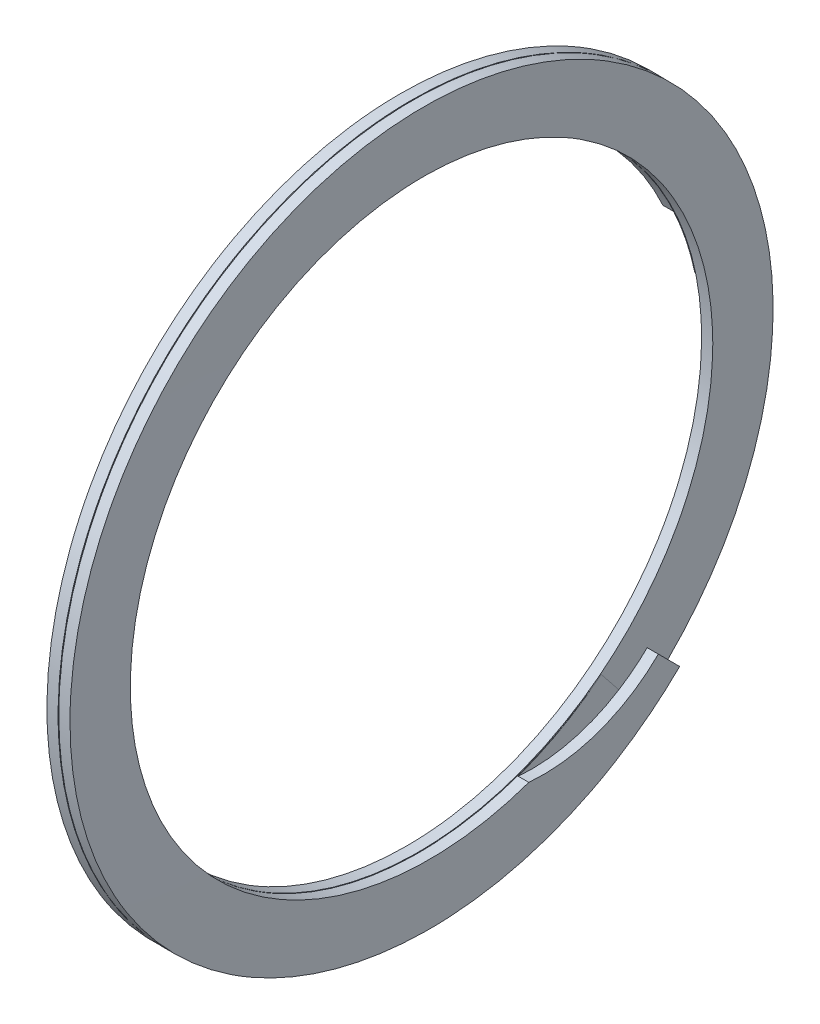
ISO-10303-21;
HEADER;
FILE_DESCRIPTION(('STEP AP214'),'2;1');
FILE_NAME('part.step','',(''),(''),'','','');
FILE_SCHEMA(('AUTOMOTIVE_DESIGN { 1 0 10303 214 1 1 1 1 }'));
ENDSEC;
DATA;
#1=APPLICATION_CONTEXT('core data for automotive mechanical design processes');
#2=APPLICATION_PROTOCOL_DEFINITION('international standard','automotive_design',2000,#1);
#3=PRODUCT_CONTEXT('',#1,'mechanical');
#4=PRODUCT('Part','Part','',(#3));
#5=PRODUCT_RELATED_PRODUCT_CATEGORY('part','',(#4));
#6=PRODUCT_DEFINITION_FORMATION('','',#4);
#7=PRODUCT_DEFINITION_CONTEXT('part definition',#1,'design');
#8=PRODUCT_DEFINITION('design','',#6,#7);
#9=PRODUCT_DEFINITION_SHAPE('','',#8);
#10=(LENGTH_UNIT() NAMED_UNIT(*) SI_UNIT(.MILLI.,.METRE.));
#11=(NAMED_UNIT(*) PLANE_ANGLE_UNIT() SI_UNIT($,.RADIAN.));
#12=(NAMED_UNIT(*) SI_UNIT($,.STERADIAN.) SOLID_ANGLE_UNIT());
#13=UNCERTAINTY_MEASURE_WITH_UNIT(LENGTH_MEASURE(1.E-05),#10,'distance_accuracy_value','');
#14=(GEOMETRIC_REPRESENTATION_CONTEXT(3) GLOBAL_UNCERTAINTY_ASSIGNED_CONTEXT((#13)) GLOBAL_UNIT_ASSIGNED_CONTEXT((#10,
#11,#12)) REPRESENTATION_CONTEXT('',''));
#15=CARTESIAN_POINT('',(0.,0.,0.));
#16=DIRECTION('',(0.,0.,1.));
#17=DIRECTION('',(1.,0.,0.));
#18=AXIS2_PLACEMENT_3D('',#15,#16,#17);
#19=CARTESIAN_POINT('',(0.211666666666667,0.,-5.5753));
#20=DIRECTION('',(0.,-1.,0.));
#21=DIRECTION('',(0.,0.,-1.));
#22=AXIS2_PLACEMENT_3D('',#19,#20,#21);
#23=PLANE('',#22);
#24=DIRECTION('',(0.,0.,-1.));
#25=VECTOR('',#24,1.);
#26=CARTESIAN_POINT('',(0.211666666666667,0.,-6.7183));
#27=LINE('',#26,#25);
#28=CARTESIAN_POINT('',(0.211666666666667,0.,-6.1468));
#29=VERTEX_POINT('',#28);
#30=CARTESIAN_POINT('',(0.211666666666667,0.,-6.7183));
#31=VERTEX_POINT('',#30);
#32=EDGE_CURVE('E268',#29,#31,#27,.T.);
#33=ORIENTED_EDGE('',*,*,#32,.F.);
#34=DIRECTION('',(-1.,0.,0.));
#35=VECTOR('',#34,1.);
#36=CARTESIAN_POINT('',(0.218722563923247,0.,-6.1468));
#37=LINE('',#36,#35);
#38=CARTESIAN_POINT('',(0.,0.,-6.1468));
#39=VERTEX_POINT('',#38);
#40=EDGE_CURVE('E186',#29,#39,#37,.T.);
#41=ORIENTED_EDGE('',*,*,#40,.T.);
#42=DIRECTION('',(0.,0.,1.));
#43=VECTOR('',#42,1.);
#44=CARTESIAN_POINT('',(0.,0.,-6.7183));
#45=LINE('',#44,#43);
#46=CARTESIAN_POINT('',(0.,0.,-6.7183));
#47=VERTEX_POINT('',#46);
#48=EDGE_CURVE('E265',#47,#39,#45,.T.);
#49=ORIENTED_EDGE('',*,*,#48,.F.);
#50=DIRECTION('',(-1.,0.,0.));
#51=VECTOR('',#50,1.);
#52=CARTESIAN_POINT('',(0.211666666666667,0.,-6.7183));
#53=LINE('',#52,#51);
#54=EDGE_CURVE('E282',#31,#47,#53,.T.);
#55=ORIENTED_EDGE('',*,*,#54,.F.);
#56=EDGE_LOOP('',(#33,#41,#49,#55));
#57=FACE_BOUND('',#56,.T.);
#58=ADVANCED_FACE('F32',(#57),#23,.T.);
#59=CARTESIAN_POINT('',(0.,0.,-6.7183));
#60=CARTESIAN_POINT('',(0.0188148148148148,3.87881231349666,-6.7183));
#61=CARTESIAN_POINT('',(0.0376296296296295,5.81821847024499,-3.35915));
#62=CARTESIAN_POINT('',(0.0564444444444443,7.75762462699332,0.));
#63=CARTESIAN_POINT('',(0.0752592592592591,5.81821847024499,3.35915));
#64=CARTESIAN_POINT('',(0.0940740740740739,3.87881231349667,6.7183));
#65=CARTESIAN_POINT('',(0.112888888888889,0.,6.7183));
#66=CARTESIAN_POINT('',(0.131703703703703,-3.87881231349666,6.7183));
#67=CARTESIAN_POINT('',(0.150518518518518,-5.81821847024499,3.35915));
#68=CARTESIAN_POINT('',(0.169333333333333,-7.75762462699332,0.));
#69=CARTESIAN_POINT('',(0.188148148148148,-5.818218470245,-3.35915));
#70=CARTESIAN_POINT('',(0.206962962962963,-3.87881231349667,-6.7183));
#71=CARTESIAN_POINT('',(0.225777777777777,0.,-6.7183));
#72=CARTESIAN_POINT('',(0.244592592592592,3.87881231349666,-6.7183));
#73=CARTESIAN_POINT('',(0.263407407407407,5.81821847024499,-3.35915));
#74=CARTESIAN_POINT('',(0.282222222222222,7.75762462699332,0.));
#75=CARTESIAN_POINT('',(0.301037037037036,5.81821847024499,3.35915));
#76=CARTESIAN_POINT('',(0.319851851851851,3.87881231349667,6.7183));
#77=CARTESIAN_POINT('',(0.338666666666666,0.,6.7183));
#78=CARTESIAN_POINT('',(0.357481481481481,-3.87881231349666,6.7183));
#79=CARTESIAN_POINT('',(0.376296296296295,-5.81821847024499,3.35915));
#80=CARTESIAN_POINT('',(0.39511111111111,-7.75762462699332,0.));
#81=CARTESIAN_POINT('',(0.413925925925925,-5.818218470245,-3.35915));
#82=CARTESIAN_POINT('',(0.43274074074074,-3.87881231349667,-6.7183));
#83=CARTESIAN_POINT('',(0.451555555555555,0.,-6.7183));
#84=CARTESIAN_POINT('',(0.,0.,-5.5753));
#85=CARTESIAN_POINT('',(0.0188148148148148,3.21890095581292,-5.5753));
#86=CARTESIAN_POINT('',(0.0376296296296295,4.82835143371938,-2.78765));
#87=CARTESIAN_POINT('',(0.0564444444444443,6.43780191162584,0.));
#88=CARTESIAN_POINT('',(0.0752592592592591,4.82835143371938,2.78765));
#89=CARTESIAN_POINT('',(0.0940740740740739,3.21890095581292,5.5753));
#90=CARTESIAN_POINT('',(0.112888888888889,0.,5.5753));
#91=CARTESIAN_POINT('',(0.131703703703703,-3.21890095581292,5.5753));
#92=CARTESIAN_POINT('',(0.150518518518518,-4.82835143371938,2.78765));
#93=CARTESIAN_POINT('',(0.169333333333333,-6.43780191162584,0.));
#94=CARTESIAN_POINT('',(0.188148148148148,-4.82835143371938,-2.78765));
#95=CARTESIAN_POINT('',(0.206962962962963,-3.21890095581292,-5.5753));
#96=CARTESIAN_POINT('',(0.225777777777777,0.,-5.5753));
#97=CARTESIAN_POINT('',(0.244592592592592,3.21890095581292,-5.5753));
#98=CARTESIAN_POINT('',(0.263407407407407,4.82835143371938,-2.78765));
#99=CARTESIAN_POINT('',(0.282222222222222,6.43780191162584,0.));
#100=CARTESIAN_POINT('',(0.301037037037036,4.82835143371938,2.78765));
#101=CARTESIAN_POINT('',(0.319851851851851,3.21890095581292,5.5753));
#102=CARTESIAN_POINT('',(0.338666666666666,0.,5.5753));
#103=CARTESIAN_POINT('',(0.357481481481481,-3.21890095581292,5.5753));
#104=CARTESIAN_POINT('',(0.376296296296295,-4.82835143371938,2.78765));
#105=CARTESIAN_POINT('',(0.39511111111111,-6.43780191162584,0.));
#106=CARTESIAN_POINT('',(0.413925925925925,-4.82835143371938,-2.78765));
#107=CARTESIAN_POINT('',(0.43274074074074,-3.21890095581292,-5.5753));
#108=CARTESIAN_POINT('',(0.451555555555555,0.,-5.5753));
#109=(BOUNDED_SURFACE() B_SPLINE_SURFACE(1,2,((#59,#60,#61,#62,#63,#64,#65,#66,#67,#68,#69,#70,
#71,#72,#73,#74,#75,#76,#77,#78,#79,#80,#81,#82,#83),(#84,#85,#86,#87,#88,#89,#90,#91,#92,#93,
#94,#95,#96,#97,#98,#99,#100,#101,#102,#103,#104,#105,#106,#107,#108)),.UNSPECIFIED.,.F.,.F.,
.F.) B_SPLINE_SURFACE_WITH_KNOTS((2,2),(3,2,2,2,2,2,2,2,2,2,2,2,3),(0.,1.),(0.,
0.0833333333333333,0.166666666666667,0.25,0.333333333333333,0.416666666666667,0.5,
0.583333333333333,0.666666666666667,0.75,0.833333333333333,0.916666666666667,1.),
.UNSPECIFIED.) GEOMETRIC_REPRESENTATION_ITEM() RATIONAL_B_SPLINE_SURFACE(((1.,0.866025403784439,
1.,0.866025403784439,1.,0.866025403784439,1.,0.866025403784439,1.,0.866025403784439,1.,
0.866025403784439,1.,0.866025403784439,1.,0.866025403784439,1.,0.866025403784439,1.,
0.866025403784439,1.,0.866025403784439,1.,0.866025403784439,1.),(1.,0.866025403784439,1.,
0.866025403784439,1.,0.866025403784439,1.,0.866025403784439,1.,0.866025403784439,1.,
0.866025403784439,1.,0.866025403784439,1.,0.866025403784439,1.,0.866025403784439,1.,
0.866025403784439,1.,0.866025403784439,1.,0.866025403784439,1.))) REPRESENTATION_ITEM('') SURFACE());
#110=CARTESIAN_POINT('',(0.423001478931439,-4.34644360397533,-4.34644432121943));
#111=CARTESIAN_POINT('',(0.422326869287209,-4.42733349051475,-4.26549969663493));
#112=CARTESIAN_POINT('',(0.421658307119178,-4.50329547718915,-4.18061420496704));
#113=CARTESIAN_POINT('',(0.420333277735516,-4.64536365080793,-4.00296148746445));
#114=CARTESIAN_POINT('',(0.419676810519884,-4.7114698377523,-3.91019426162976));
#115=CARTESIAN_POINT('',(0.419026390780453,-4.77264812483166,-3.81348616871167));
#116=B_SPLINE_CURVE_WITH_KNOTS('',3,(#110,#111,#112,#113,#114,#115),.UNSPECIFIED.,.F.,.F.,(4,2,
4),(0.,0.341739599425282,0.683479198850562),.UNSPECIFIED.);
#117=CARTESIAN_POINT('',(0.423167406132386,-4.34644360397537,-4.34644432121946));
#118=VERTEX_POINT('',#117);
#119=CARTESIAN_POINT('',(0.419026390780453,-4.77264812483164,-3.8134861687117));
#120=VERTEX_POINT('',#119);
#121=EDGE_CURVE('E112',#118,#120,#116,.T.);
#122=DIRECTION('',(0.,0.70710678118653,0.707106781186565));
#123=VECTOR('',#122,1.);
#124=CARTESIAN_POINT('',(0.423333333333333,-4.75055548804546,-4.7505554880457));
#125=LINE('',#124,#123);
#126=CARTESIAN_POINT('',(0.423166648143642,-4.75055511777032,-4.75055585832074));
#127=VERTEX_POINT('',#126);
#128=EDGE_CURVE('E35',#127,#118,#125,.T.);
#129=CARTESIAN_POINT('',(0.,0.,-6.7183));
#130=CARTESIAN_POINT('',(0.0188148148148148,3.87881231349666,-6.7183));
#131=CARTESIAN_POINT('',(0.0376296296296295,5.81821847024499,-3.35915));
#132=CARTESIAN_POINT('',(0.0564444444444443,7.75762462699332,0.));
#133=CARTESIAN_POINT('',(0.0752592592592591,5.81821847024499,3.35915));
#134=CARTESIAN_POINT('',(0.0940740740740739,3.87881231349667,6.7183));
#135=CARTESIAN_POINT('',(0.112888888888889,0.,6.7183));
#136=CARTESIAN_POINT('',(0.131703703703703,-3.87881231349666,6.7183));
#137=CARTESIAN_POINT('',(0.150518518518518,-5.81821847024499,3.35915));
#138=CARTESIAN_POINT('',(0.169333333333333,-7.75762462699332,0.));
#139=CARTESIAN_POINT('',(0.188148148148148,-5.818218470245,-3.35915));
#140=CARTESIAN_POINT('',(0.206962962962963,-3.87881231349667,-6.7183));
#141=CARTESIAN_POINT('',(0.225777777777777,0.,-6.7183));
#142=CARTESIAN_POINT('',(0.244592592592592,3.87881231349666,-6.7183));
#143=CARTESIAN_POINT('',(0.263407407407407,5.81821847024499,-3.35915));
#144=CARTESIAN_POINT('',(0.282222222222222,7.75762462699332,0.));
#145=CARTESIAN_POINT('',(0.301037037037036,5.818218470245,3.35914999999999));
#146=CARTESIAN_POINT('',(0.319851851851851,3.87881231349667,6.71829999999999));
#147=CARTESIAN_POINT('',(0.338666666666666,0.,6.7183));
#148=CARTESIAN_POINT('',(0.357481481481481,-3.87881231349666,6.7183));
#149=CARTESIAN_POINT('',(0.376296296296295,-5.81821847024499,3.35915000000001));
#150=CARTESIAN_POINT('',(0.39511111111111,-7.75762462699332,0.));
#151=CARTESIAN_POINT('',(0.413925925925925,-5.818218470245,-3.35914999999999));
#152=CARTESIAN_POINT('',(0.43274074074074,-3.87881231349667,-6.71829999999999));
#153=CARTESIAN_POINT('',(0.451555555555555,0.,-6.7183));
#154=(BOUNDED_CURVE() B_SPLINE_CURVE(2,(#129,#130,#131,#132,#133,#134,#135,#136,#137,#138,#139,
#140,#141,#142,#143,#144,#145,#146,#147,#148,#149,#150,#151,#152,#153),.UNSPECIFIED.,.F.,
.F.) B_SPLINE_CURVE_WITH_KNOTS((3,2,2,2,2,2,2,2,2,2,2,2,3),(0.,0.0833333333333333,
0.166666666666667,0.25,0.333333333333333,0.416666666666667,0.5,0.583333333333333,
0.666666666666667,0.75,0.833333333333333,0.916666666666667,1.),
.UNSPECIFIED.) CURVE() GEOMETRIC_REPRESENTATION_ITEM() RATIONAL_B_SPLINE_CURVE((1.,
0.866025403784439,1.,0.866025403784439,1.,0.866025403784439,1.,0.866025403784439,1.,
0.866025403784439,1.,0.866025403784439,1.,0.866025403784439,1.,0.866025403784439,1.,
0.866025403784439,1.,0.866025403784439,1.,0.866025403784439,1.,0.866025403784439,1.)) REPRESENTATION_ITEM(''));
#155=EDGE_CURVE('E253',#47,#127,#154,.T.);
#156=CARTESIAN_POINT('',(0.,0.,-6.1468));
#157=CARTESIAN_POINT('',(0.000459855154340558,0.0867390332436209,-6.14680840386976));
#158=CARTESIAN_POINT('',(0.000925320167877159,0.173474234481937,-6.14314145356558));
#159=CARTESIAN_POINT('',(0.00186664739999395,0.346326178983546,-6.12852126715385));
#160=CARTESIAN_POINT('',(0.00234250934474222,0.432442938456029,-6.11756822272252));
#161=CARTESIAN_POINT('',(0.00330370722968058,0.603429601239146,-6.08844405102077));
#162=CARTESIAN_POINT('',(0.0037890406743925,0.688299822919678,-6.07027480124511));
#163=CARTESIAN_POINT('',(0.00476826083430785,0.856185944339623,-6.02686471345591));
#164=CARTESIAN_POINT('',(0.00526214724722489,0.939201909377285,-6.00162412488711));
#165=CARTESIAN_POINT('',(0.00675612056951717,1.18470316238575,-5.9154929243309));
#166=CARTESIAN_POINT('',(0.00776866174448775,1.34366700645911,-5.84418856110767));
#167=CARTESIAN_POINT('',(0.00981663711078338,1.64714462695747,-5.67596650034187));
#168=CARTESIAN_POINT('',(0.0108520433944109,1.79167494560299,-5.57907859931022));
#169=CARTESIAN_POINT('',(0.0124976222770556,2.00512729277105,-5.40832581014503));
#170=CARTESIAN_POINT('',(0.0131027199846867,2.08020360591022,-5.34201696728692));
#171=CARTESIAN_POINT('',(0.0143164008409924,2.22348825923495,-5.20250601238596));
#172=CARTESIAN_POINT('',(0.0149249793400266,2.29170417925359,-5.12931168493756));
#173=CARTESIAN_POINT('',(0.0155351764951114,2.35622359468146,-5.05293780506714));
#174=B_SPLINE_CURVE_WITH_KNOTS('',3,(#156,#157,#158,#159,#160,#161,#162,#163,#164,#165,#166,
#167,#168,#169,#170,#171,#172,#173),.UNSPECIFIED.,.F.,.F.,(4,2,2,2,2,2,2,2,4),(0.,
0.260136445567346,0.520266047962052,0.780328014758219,1.04038080890276,1.56041067518249,
2.07983752678275,2.37991096728854,2.67964913712295),.UNSPECIFIED.);
#175=CARTESIAN_POINT('',(0.015535176495125,2.35622359468289,-5.05293780506545));
#176=VERTEX_POINT('',#175);
#177=EDGE_CURVE('E184',#39,#176,#174,.T.);
#178=CARTESIAN_POINT('',(0.,0.,-5.5753));
#179=CARTESIAN_POINT('',(0.0188148148148148,3.21890095581292,-5.5753));
#180=CARTESIAN_POINT('',(0.0376296296296295,4.82835143371938,-2.78765));
#181=CARTESIAN_POINT('',(0.0564444444444443,6.43780191162584,0.));
#182=CARTESIAN_POINT('',(0.0752592592592591,4.82835143371938,2.78765));
#183=CARTESIAN_POINT('',(0.0940740740740739,3.21890095581292,5.5753));
#184=CARTESIAN_POINT('',(0.112888888888889,0.,5.5753));
#185=CARTESIAN_POINT('',(0.131703703703703,-3.21890095581292,5.5753));
#186=CARTESIAN_POINT('',(0.150518518518518,-4.82835143371938,2.78765));
#187=CARTESIAN_POINT('',(0.169333333333333,-6.43780191162584,0.));
#188=CARTESIAN_POINT('',(0.188148148148148,-4.82835143371938,-2.78765));
#189=CARTESIAN_POINT('',(0.206962962962963,-3.21890095581292,-5.5753));
#190=CARTESIAN_POINT('',(0.225777777777777,0.,-5.5753));
#191=CARTESIAN_POINT('',(0.244592592592592,3.21890095581292,-5.5753));
#192=CARTESIAN_POINT('',(0.263407407407407,4.82835143371938,-2.78765));
#193=CARTESIAN_POINT('',(0.282222222222222,6.43780191162584,0.));
#194=CARTESIAN_POINT('',(0.301037037037036,4.82835143371938,2.78765));
#195=CARTESIAN_POINT('',(0.319851851851851,3.21890095581293,5.5753));
#196=CARTESIAN_POINT('',(0.338666666666666,0.,5.5753));
#197=CARTESIAN_POINT('',(0.357481481481481,-3.21890095581291,5.5753));
#198=CARTESIAN_POINT('',(0.376296296296295,-4.82835143371938,2.78765000000001));
#199=CARTESIAN_POINT('',(0.39511111111111,-6.43780191162584,0.));
#200=CARTESIAN_POINT('',(0.413925925925925,-4.82835143371938,-2.78765));
#201=CARTESIAN_POINT('',(0.43274074074074,-3.21890095581293,-5.5753));
#202=CARTESIAN_POINT('',(0.451555555555555,0.,-5.5753));
#203=(BOUNDED_CURVE() B_SPLINE_CURVE(2,(#178,#179,#180,#181,#182,#183,#184,#185,#186,#187,#188,
#189,#190,#191,#192,#193,#194,#195,#196,#197,#198,#199,#200,#201,#202),.UNSPECIFIED.,.F.,
.F.) B_SPLINE_CURVE_WITH_KNOTS((3,2,2,2,2,2,2,2,2,2,2,2,3),(0.,0.0833333333333333,
0.166666666666667,0.25,0.333333333333333,0.416666666666667,0.5,0.583333333333333,
0.666666666666667,0.75,0.833333333333333,0.916666666666667,1.),
.UNSPECIFIED.) CURVE() GEOMETRIC_REPRESENTATION_ITEM() RATIONAL_B_SPLINE_CURVE((1.,
0.866025403784439,1.,0.866025403784439,1.,0.866025403784439,1.,0.866025403784439,1.,
0.866025403784439,1.,0.866025403784439,1.,0.866025403784439,1.,0.866025403784439,1.,
0.866025403784439,1.,0.866025403784439,1.,0.866025403784439,1.,0.866025403784439,1.)) REPRESENTATION_ITEM(''));
#204=CARTESIAN_POINT('',(0.419026390780453,-4.35563934550005,-3.48028389387009));
#205=VERTEX_POINT('',#204);
#206=EDGE_CURVE('E260',#176,#205,#203,.T.);
#207=CARTESIAN_POINT('',(0.419026390780453,-5.24859501997615,-4.19378173088223));
#208=CARTESIAN_POINT('',(0.419026390780453,-5.16267032013729,-4.1251253695047));
#209=CARTESIAN_POINT('',(0.419026390780453,-5.07674562029843,-4.05646900812717));
#210=CARTESIAN_POINT('',(0.419026390780453,-4.90489622062071,-3.91915628537212));
#211=CARTESIAN_POINT('',(0.419026390780453,-4.81897152078185,-3.85049992399459));
#212=CARTESIAN_POINT('',(0.419026390780453,-4.60724432912868,-3.68132367303474));
#213=CARTESIAN_POINT('',(0.419026390780453,-4.48144183731438,-3.58080378345243));
#214=CARTESIAN_POINT('',(0.419026390780453,-4.35563934550007,-3.48028389387011));
#215=B_SPLINE_CURVE_WITH_KNOTS('',3,(#207,#208,#209,#210,#211,#212,#213,#214),.UNSPECIFIED.,.F.,
.F.,(4,2,2,4),(0.,0.329955678841871,0.659911357683742,1.143),.UNSPECIFIED.);
#216=EDGE_CURVE('E103',#120,#205,#215,.T.);
#217=ORIENTED_EDGE('',*,*,#121,.F.);
#218=ORIENTED_EDGE('',*,*,#128,.F.);
#219=ORIENTED_EDGE('',*,*,#155,.F.);
#220=ORIENTED_EDGE('',*,*,#48,.T.);
#221=ORIENTED_EDGE('',*,*,#177,.T.);
#222=ORIENTED_EDGE('',*,*,#206,.T.);
#223=ORIENTED_EDGE('',*,*,#216,.F.);
#224=EDGE_LOOP('',(#217,#218,#219,#220,#221,#222,#223));
#225=FACE_BOUND('',#224,.T.);
#226=ADVANCED_FACE('F155',(#225),#109,.T.);
#227=CARTESIAN_POINT('',(0.,0.,0.));
#228=DIRECTION('',(1.,0.,0.));
#229=DIRECTION('',(0.,0.,-1.));
#230=AXIS2_PLACEMENT_3D('',#227,#228,#229);
#231=CYLINDRICAL_SURFACE('',#230,5.5753);
#232=DIRECTION('',(1.,0.,0.));
#233=VECTOR('',#232,1.);
#234=CARTESIAN_POINT('',(0.419026390780453,-5.23906810084237,-1.90686536617969));
#235=LINE('',#234,#233);
#236=CARTESIAN_POINT('',(0.419026390780453,-5.23906810084237,-1.90686536617969));
#237=VERTEX_POINT('',#236);
#238=CARTESIAN_POINT('',(0.619647872209092,-5.23906810084237,-1.90686536617969));
#239=VERTEX_POINT('',#238);
#240=EDGE_CURVE('E108',#237,#239,#235,.T.);
#241=ORIENTED_EDGE('',*,*,#240,.F.);
#242=CARTESIAN_POINT('',(0.419026390780453,0.,0.));
#243=DIRECTION('',(-1.,0.,0.));
#244=DIRECTION('',(0.,0.,1.));
#245=AXIS2_PLACEMENT_3D('',#242,#243,#244);
#246=CIRCLE('',#245,5.57529999999997);
#247=EDGE_CURVE('E98',#205,#237,#246,.T.);
#248=ORIENTED_EDGE('',*,*,#247,.F.);
#249=ORIENTED_EDGE('',*,*,#206,.F.);
#250=DIRECTION('',(-1.,0.,0.));
#251=VECTOR('',#250,1.);
#252=CARTESIAN_POINT('',(0.218722563923247,2.35622359468289,-5.05293780506545));
#253=LINE('',#252,#251);
#254=CARTESIAN_POINT('',(0.218722563923247,2.35622359468289,-5.05293780506545));
#255=VERTEX_POINT('',#254);
#256=EDGE_CURVE('E189',#255,#176,#253,.T.);
#257=ORIENTED_EDGE('',*,*,#256,.F.);
#258=CARTESIAN_POINT('',(0.218722563923247,0.,0.));
#259=DIRECTION('',(-1.,0.,0.));
#260=DIRECTION('',(0.,0.,-1.));
#261=AXIS2_PLACEMENT_3D('',#258,#259,#260);
#262=CIRCLE('',#261,5.5753);
#263=CARTESIAN_POINT('',(0.218722563923247,1.13923059145724,-5.45766651138451));
#264=VERTEX_POINT('',#263);
#265=EDGE_CURVE('E190',#255,#264,#262,.T.);
#266=ORIENTED_EDGE('',*,*,#265,.T.);
#267=CARTESIAN_POINT('',(0.211666666666667,0.,-5.5753));
#268=CARTESIAN_POINT('',(0.230481481481482,3.21890095581292,-5.5753));
#269=CARTESIAN_POINT('',(0.249296296296296,4.82835143371938,-2.78765));
#270=CARTESIAN_POINT('',(0.268111111111111,6.43780191162584,0.));
#271=CARTESIAN_POINT('',(0.286925925925926,4.82835143371938,2.78765));
#272=CARTESIAN_POINT('',(0.305740740740741,3.21890095581292,5.5753));
#273=CARTESIAN_POINT('',(0.324555555555555,0.,5.5753));
#274=CARTESIAN_POINT('',(0.34337037037037,-3.21890095581292,5.5753));
#275=CARTESIAN_POINT('',(0.362185185185185,-4.82835143371938,2.78765));
#276=CARTESIAN_POINT('',(0.381,-6.43780191162584,0.));
#277=CARTESIAN_POINT('',(0.399814814814815,-4.82835143371938,-2.78765));
#278=CARTESIAN_POINT('',(0.418629629629629,-3.21890095581292,-5.5753));
#279=CARTESIAN_POINT('',(0.437444444444444,0.,-5.5753));
#280=CARTESIAN_POINT('',(0.456259259259259,3.21890095581292,-5.5753));
#281=CARTESIAN_POINT('',(0.475074074074074,4.82835143371938,-2.78765));
#282=CARTESIAN_POINT('',(0.493888888888888,6.43780191162584,0.));
#283=CARTESIAN_POINT('',(0.512703703703703,4.82835143371938,2.78765));
#284=CARTESIAN_POINT('',(0.531518518518518,3.21890095581293,5.5753));
#285=CARTESIAN_POINT('',(0.550333333333333,0.,5.5753));
#286=CARTESIAN_POINT('',(0.569148148148148,-3.21890095581291,5.5753));
#287=CARTESIAN_POINT('',(0.587962962962962,-4.82835143371938,2.78765000000001));
#288=CARTESIAN_POINT('',(0.606777777777777,-6.43780191162584,0.));
#289=CARTESIAN_POINT('',(0.625592592592592,-4.82835143371938,-2.78765));
#290=CARTESIAN_POINT('',(0.644407407407407,-3.21890095581293,-5.5753));
#291=CARTESIAN_POINT('',(0.663222222222221,0.,-5.5753));
#292=(BOUNDED_CURVE() B_SPLINE_CURVE(2,(#267,#268,#269,#270,#271,#272,#273,#274,#275,#276,#277,
#278,#279,#280,#281,#282,#283,#284,#285,#286,#287,#288,#289,#290,#291),.UNSPECIFIED.,.F.,
.F.) B_SPLINE_CURVE_WITH_KNOTS((3,2,2,2,2,2,2,2,2,2,2,2,3),(0.,0.0833333333333333,
0.166666666666667,0.25,0.333333333333333,0.416666666666667,0.5,0.583333333333333,
0.666666666666667,0.75,0.833333333333333,0.916666666666667,1.),
.UNSPECIFIED.) CURVE() GEOMETRIC_REPRESENTATION_ITEM() RATIONAL_B_SPLINE_CURVE((1.,
0.866025403784439,1.,0.866025403784439,1.,0.866025403784439,1.,0.866025403784439,1.,
0.866025403784439,1.,0.866025403784439,1.,0.866025403784439,1.,0.866025403784439,1.,
0.866025403784439,1.,0.866025403784439,1.,0.866025403784439,1.,0.866025403784439,1.)) REPRESENTATION_ITEM(''));
#293=EDGE_CURVE('E118',#264,#239,#292,.T.);
#294=ORIENTED_EDGE('',*,*,#293,.T.);
#295=EDGE_LOOP('',(#241,#248,#249,#257,#266,#294));
#296=FACE_BOUND('',#295,.T.);
#297=ADVANCED_FACE('F115',(#296),#231,.F.);
#298=CARTESIAN_POINT('',(0.211666666666667,0.,-5.5753));
#299=CARTESIAN_POINT('',(0.230481481481482,3.21890095581292,-5.5753));
#300=CARTESIAN_POINT('',(0.249296296296296,4.82835143371938,-2.78765));
#301=CARTESIAN_POINT('',(0.268111111111111,6.43780191162584,0.));
#302=CARTESIAN_POINT('',(0.286925925925926,4.82835143371938,2.78765));
#303=CARTESIAN_POINT('',(0.305740740740741,3.21890095581292,5.5753));
#304=CARTESIAN_POINT('',(0.324555555555555,0.,5.5753));
#305=CARTESIAN_POINT('',(0.34337037037037,-3.21890095581292,5.5753));
#306=CARTESIAN_POINT('',(0.362185185185185,-4.82835143371938,2.78765));
#307=CARTESIAN_POINT('',(0.381,-6.43780191162584,0.));
#308=CARTESIAN_POINT('',(0.399814814814815,-4.82835143371938,-2.78765));
#309=CARTESIAN_POINT('',(0.418629629629629,-3.21890095581292,-5.5753));
#310=CARTESIAN_POINT('',(0.437444444444444,0.,-5.5753));
#311=CARTESIAN_POINT('',(0.456259259259259,3.21890095581292,-5.5753));
#312=CARTESIAN_POINT('',(0.475074074074074,4.82835143371938,-2.78765));
#313=CARTESIAN_POINT('',(0.493888888888888,6.43780191162584,0.));
#314=CARTESIAN_POINT('',(0.512703703703703,4.82835143371938,2.78765));
#315=CARTESIAN_POINT('',(0.531518518518518,3.21890095581292,5.5753));
#316=CARTESIAN_POINT('',(0.550333333333333,0.,5.5753));
#317=CARTESIAN_POINT('',(0.569148148148148,-3.21890095581292,5.5753));
#318=CARTESIAN_POINT('',(0.587962962962962,-4.82835143371938,2.78765));
#319=CARTESIAN_POINT('',(0.606777777777777,-6.43780191162584,0.));
#320=CARTESIAN_POINT('',(0.625592592592592,-4.82835143371938,-2.78765));
#321=CARTESIAN_POINT('',(0.644407407407407,-3.21890095581292,-5.5753));
#322=CARTESIAN_POINT('',(0.663222222222221,0.,-5.5753));
#323=CARTESIAN_POINT('',(0.211666666666667,0.,-6.7183));
#324=CARTESIAN_POINT('',(0.230481481481481,3.87881231349666,-6.7183));
#325=CARTESIAN_POINT('',(0.249296296296296,5.81821847024499,-3.35915));
#326=CARTESIAN_POINT('',(0.268111111111111,7.75762462699332,0.));
#327=CARTESIAN_POINT('',(0.286925925925926,5.81821847024499,3.35915));
#328=CARTESIAN_POINT('',(0.305740740740741,3.87881231349667,6.7183));
#329=CARTESIAN_POINT('',(0.324555555555555,0.,6.7183));
#330=CARTESIAN_POINT('',(0.34337037037037,-3.87881231349666,6.7183));
#331=CARTESIAN_POINT('',(0.362185185185185,-5.81821847024499,3.35915));
#332=CARTESIAN_POINT('',(0.381,-7.75762462699332,0.));
#333=CARTESIAN_POINT('',(0.399814814814814,-5.818218470245,-3.35915));
#334=CARTESIAN_POINT('',(0.418629629629629,-3.87881231349667,-6.7183));
#335=CARTESIAN_POINT('',(0.437444444444444,0.,-6.7183));
#336=CARTESIAN_POINT('',(0.456259259259259,3.87881231349666,-6.7183));
#337=CARTESIAN_POINT('',(0.475074074074073,5.81821847024499,-3.35915));
#338=CARTESIAN_POINT('',(0.493888888888888,7.75762462699332,0.));
#339=CARTESIAN_POINT('',(0.512703703703703,5.81821847024499,3.35915));
#340=CARTESIAN_POINT('',(0.531518518518518,3.87881231349667,6.7183));
#341=CARTESIAN_POINT('',(0.550333333333333,0.,6.7183));
#342=CARTESIAN_POINT('',(0.569148148148147,-3.87881231349666,6.7183));
#343=CARTESIAN_POINT('',(0.587962962962962,-5.81821847024499,3.35915));
#344=CARTESIAN_POINT('',(0.606777777777777,-7.75762462699332,0.));
#345=CARTESIAN_POINT('',(0.625592592592592,-5.818218470245,-3.35915));
#346=CARTESIAN_POINT('',(0.644407407407406,-3.87881231349667,-6.7183));
#347=CARTESIAN_POINT('',(0.663222222222221,0.,-6.7183));
#348=(BOUNDED_SURFACE() B_SPLINE_SURFACE(1,2,((#298,#299,#300,#301,#302,#303,#304,#305,#306,
#307,#308,#309,#310,#311,#312,#313,#314,#315,#316,#317,#318,#319,#320,#321,#322),(#323,#324,
#325,#326,#327,#328,#329,#330,#331,#332,#333,#334,#335,#336,#337,#338,#339,#340,#341,#342,#343,
#344,#345,#346,#347)),.UNSPECIFIED.,.F.,.F.,.F.) B_SPLINE_SURFACE_WITH_KNOTS((2,2),(3,2,2,2,2,2,
2,2,2,2,2,2,3),(0.,1.),(0.,0.0833333333333333,0.166666666666667,0.25,0.333333333333333,
0.416666666666667,0.5,0.583333333333333,0.666666666666667,0.75,0.833333333333333,
0.916666666666667,1.),
.UNSPECIFIED.) GEOMETRIC_REPRESENTATION_ITEM() RATIONAL_B_SPLINE_SURFACE(((1.,0.866025403784439,
1.,0.866025403784439,1.,0.866025403784439,1.,0.866025403784439,1.,0.866025403784439,1.,
0.866025403784439,1.,0.866025403784439,1.,0.866025403784439,1.,0.866025403784439,1.,
0.866025403784439,1.,0.866025403784439,1.,0.866025403784439,1.),(1.,0.866025403784439,1.,
0.866025403784439,1.,0.866025403784439,1.,0.866025403784439,1.,0.866025403784439,1.,
0.866025403784439,1.,0.866025403784439,1.,0.866025403784439,1.,0.866025403784439,1.,
0.866025403784439,1.,0.866025403784439,1.,0.866025403784439,1.))) REPRESENTATION_ITEM('') SURFACE());
#349=CARTESIAN_POINT('',(0.619647872209092,-5.2390681008424,-1.9068653661797));
#350=CARTESIAN_POINT('',(0.620147505941713,-5.24634302769611,-1.99329874832244));
#351=CARTESIAN_POINT('',(0.620642828083451,-5.24995520593463,-2.0800362701584));
#352=CARTESIAN_POINT('',(0.621624801337743,-5.24986706630478,-2.25350554617497));
#353=CARTESIAN_POINT('',(0.622111452677733,-5.24616694052479,-2.34023730044723));
#354=CARTESIAN_POINT('',(0.623075937349772,-5.23146948551195,-2.51306313194133));
#355=CARTESIAN_POINT('',(0.623553772941345,-5.22047405357972,-2.59915736907809));
#356=CARTESIAN_POINT('',(0.624495768416191,-5.19128104507959,-2.77009056993409));
#357=CARTESIAN_POINT('',(0.624959928781442,-5.17308372266659,-2.85492957784083));
#358=CARTESIAN_POINT('',(0.626354078832349,-5.10782175540355,-3.10678421133712));
#359=CARTESIAN_POINT('',(0.627285873715622,-5.05008489402659,-3.27116322345343));
#360=CARTESIAN_POINT('',(0.629198058873819,-4.90787724518026,-3.58766749677951));
#361=CARTESIAN_POINT('',(0.630178391540956,-4.82343753792016,-3.73980674724757));
#362=CARTESIAN_POINT('',(0.631745967358284,-4.67116683248205,-3.96681294043759));
#363=CARTESIAN_POINT('',(0.632324380286167,-4.61138098342596,-4.04717963514042));
#364=CARTESIAN_POINT('',(0.633489685239753,-4.48436502338517,-4.20164675966995));
#365=CARTESIAN_POINT('',(0.634076567070678,-4.41714330374462,-4.27575408985428));
#366=CARTESIAN_POINT('',(0.634668145598105,-4.34644360397538,-4.34644432121945));
#367=B_SPLINE_CURVE_WITH_KNOTS('',3,(#349,#350,#351,#352,#353,#354,#355,#356,#357,#358,#359,
#360,#361,#362,#363,#364,#365,#366),.UNSPECIFIED.,.F.,.F.,(4,2,2,2,2,2,2,2,4),(0.,
0.260137006948696,0.520267180396567,0.780329727925617,1.04038309865926,1.56041320996112,
2.07984025735015,2.37991080924638,2.6796461225647),.UNSPECIFIED.);
#368=CARTESIAN_POINT('',(0.634834076156211,-4.34644374045734,-4.34644490198074));
#369=VERTEX_POINT('',#368);
#370=EDGE_CURVE('E49',#239,#369,#367,.T.);
#371=CARTESIAN_POINT('',(0.218722563923247,1.28444996640936,-6.15336317316961));
#372=CARTESIAN_POINT('',(0.218722563923247,1.26024673725067,-6.03741372953876));
#373=CARTESIAN_POINT('',(0.218722563923247,1.23604350809199,-5.92146428590791));
#374=CARTESIAN_POINT('',(0.218722563923247,1.18763704977462,-5.68956539864621));
#375=CARTESIAN_POINT('',(0.218722563923247,1.16343382061593,-5.57361595501536));
#376=CARTESIAN_POINT('',(0.218722563923247,1.13923059145724,-5.45766651138451));
#377=B_SPLINE_CURVE_WITH_KNOTS('',3,(#371,#372,#373,#374,#375,#376),.UNSPECIFIED.,.F.,.F.,(4,2,
4),(0.,0.355345786551779,0.710691573103558),.UNSPECIFIED.);
#378=CARTESIAN_POINT('',(0.218722563923247,1.22970268138011,-5.8910875405331));
#379=VERTEX_POINT('',#378);
#380=EDGE_CURVE('E232',#379,#264,#377,.T.);
#381=CARTESIAN_POINT('',(0.218722563923247,1.22970268138011,-5.8910875405331));
#382=CARTESIAN_POINT('',(0.218213922473959,1.14950296774146,-5.92596041897026));
#383=CARTESIAN_POINT('',(0.21770886918216,1.06781337789925,-5.95740444687737));
#384=CARTESIAN_POINT('',(0.216706703849164,0.902036441672318,-6.01325601107213));
#385=CARTESIAN_POINT('',(0.216209594156438,0.81794840594243,-6.03766150153385));
#386=CARTESIAN_POINT('',(0.215232711977284,0.649441521634463,-6.07888501929999));
#387=CARTESIAN_POINT('',(0.214752788461444,0.565052341357267,-6.09582443459604));
#388=CARTESIAN_POINT('',(0.213802655626939,0.395186940827015,-6.1225872750878));
#389=CARTESIAN_POINT('',(0.213332442359097,0.309711186284209,-6.13241365083798));
#390=CARTESIAN_POINT('',(0.212463151268024,0.149446789768871,-6.14408576015705));
#391=CARTESIAN_POINT('',(0.212062806363185,0.0747210098250241,-6.14680648588865));
#392=CARTESIAN_POINT('',(0.211666666666667,0.,-6.14680000000006));
#393=B_SPLINE_CURVE_WITH_KNOTS('',3,(#381,#382,#383,#384,#385,#386,#387,#388,#389,#390,#391,
#392),.UNSPECIFIED.,.F.,.F.,(4,2,2,2,2,4),(0.,0.262285115282935,0.524646389873359,
0.782568702795875,1.0403839657576,1.26451319639494),.UNSPECIFIED.);
#394=EDGE_CURVE('E41',#379,#29,#393,.T.);
#395=CARTESIAN_POINT('',(0.211666666666667,0.,-6.7183));
#396=CARTESIAN_POINT('',(0.230481481481481,3.87881231349666,-6.7183));
#397=CARTESIAN_POINT('',(0.249296296296296,5.81821847024499,-3.35915));
#398=CARTESIAN_POINT('',(0.268111111111111,7.75762462699332,0.));
#399=CARTESIAN_POINT('',(0.286925925925926,5.81821847024499,3.35915));
#400=CARTESIAN_POINT('',(0.305740740740741,3.87881231349667,6.7183));
#401=CARTESIAN_POINT('',(0.324555555555555,0.,6.7183));
#402=CARTESIAN_POINT('',(0.34337037037037,-3.87881231349666,6.7183));
#403=CARTESIAN_POINT('',(0.362185185185185,-5.81821847024499,3.35915));
#404=CARTESIAN_POINT('',(0.381,-7.75762462699332,0.));
#405=CARTESIAN_POINT('',(0.399814814814814,-5.818218470245,-3.35915));
#406=CARTESIAN_POINT('',(0.418629629629629,-3.87881231349667,-6.7183));
#407=CARTESIAN_POINT('',(0.437444444444444,0.,-6.7183));
#408=CARTESIAN_POINT('',(0.456259259259259,3.87881231349666,-6.7183));
#409=CARTESIAN_POINT('',(0.475074074074073,5.81821847024499,-3.35915));
#410=CARTESIAN_POINT('',(0.493888888888888,7.75762462699332,0.));
#411=CARTESIAN_POINT('',(0.512703703703703,5.818218470245,3.35914999999999));
#412=CARTESIAN_POINT('',(0.531518518518518,3.87881231349667,6.71829999999999));
#413=CARTESIAN_POINT('',(0.550333333333333,0.,6.7183));
#414=CARTESIAN_POINT('',(0.569148148148147,-3.87881231349666,6.7183));
#415=CARTESIAN_POINT('',(0.587962962962962,-5.81821847024499,3.35915000000001));
#416=CARTESIAN_POINT('',(0.606777777777777,-7.75762462699332,0.));
#417=CARTESIAN_POINT('',(0.625592592592592,-5.818218470245,-3.35914999999999));
#418=CARTESIAN_POINT('',(0.644407407407406,-3.87881231349667,-6.71829999999999));
#419=CARTESIAN_POINT('',(0.663222222222221,0.,-6.7183));
#420=(BOUNDED_CURVE() B_SPLINE_CURVE(2,(#395,#396,#397,#398,#399,#400,#401,#402,#403,#404,#405,
#406,#407,#408,#409,#410,#411,#412,#413,#414,#415,#416,#417,#418,#419),.UNSPECIFIED.,.F.,
.F.) B_SPLINE_CURVE_WITH_KNOTS((3,2,2,2,2,2,2,2,2,2,2,2,3),(0.,0.0833333333333333,
0.166666666666667,0.25,0.333333333333333,0.416666666666667,0.5,0.583333333333333,
0.666666666666667,0.75,0.833333333333333,0.916666666666667,1.),
.UNSPECIFIED.) CURVE() GEOMETRIC_REPRESENTATION_ITEM() RATIONAL_B_SPLINE_CURVE((1.,
0.866025403784439,1.,0.866025403784439,1.,0.866025403784439,1.,0.866025403784439,1.,
0.866025403784439,1.,0.866025403784439,1.,0.866025403784439,1.,0.866025403784439,1.,
0.866025403784439,1.,0.866025403784439,1.,0.866025403784439,1.,0.866025403784439,1.)) REPRESENTATION_ITEM(''));
#421=CARTESIAN_POINT('',(0.634842876133564,-4.75055505065611,-4.75055592543492));
#422=VERTEX_POINT('',#421);
#423=EDGE_CURVE('E275',#31,#422,#420,.T.);
#424=DIRECTION('',(0.,-0.70710678118653,-0.707106781186565));
#425=VECTOR('',#424,1.);
#426=CARTESIAN_POINT('',(0.635,-4.75055548804546,-4.7505554880457));
#427=LINE('',#426,#425);
#428=EDGE_CURVE('E197',#369,#422,#427,.T.);
#429=ORIENTED_EDGE('',*,*,#370,.F.);
#430=ORIENTED_EDGE('',*,*,#293,.F.);
#431=ORIENTED_EDGE('',*,*,#380,.F.);
#432=ORIENTED_EDGE('',*,*,#394,.T.);
#433=ORIENTED_EDGE('',*,*,#32,.T.);
#434=ORIENTED_EDGE('',*,*,#423,.T.);
#435=ORIENTED_EDGE('',*,*,#428,.F.);
#436=EDGE_LOOP('',(#429,#430,#431,#432,#433,#434,#435));
#437=FACE_BOUND('',#436,.T.);
#438=ADVANCED_FACE('F130',(#437),#348,.T.);
#439=CARTESIAN_POINT('',(0.635,-3.94233243714926,-3.94233243714946));
#440=DIRECTION('',(0.,-0.707106781186565,0.70710678118653));
#441=DIRECTION('',(0.,-0.70710678118653,-0.707106781186565));
#442=AXIS2_PLACEMENT_3D('',#439,#440,#441);
#443=PLANE('',#442);
#444=ORIENTED_EDGE('',*,*,#128,.T.);
#445=DIRECTION('',(1.,0.,0.));
#446=VECTOR('',#445,1.);
#447=CARTESIAN_POINT('',(0.419026390780453,-4.3464439625973,-4.34644396259752));
#448=LINE('',#447,#446);
#449=EDGE_CURVE('E11',#118,#369,#448,.T.);
#450=ORIENTED_EDGE('',*,*,#449,.T.);
#451=ORIENTED_EDGE('',*,*,#428,.T.);
#452=DIRECTION('',(-1.,0.,0.));
#453=VECTOR('',#452,1.);
#454=CARTESIAN_POINT('',(0.635,-4.75055548804546,-4.7505554880457));
#455=LINE('',#454,#453);
#456=EDGE_CURVE('E224',#422,#127,#455,.T.);
#457=ORIENTED_EDGE('',*,*,#456,.T.);
#458=EDGE_LOOP('',(#444,#450,#451,#457));
#459=FACE_BOUND('',#458,.T.);
#460=ADVANCED_FACE('F209',(#459),#443,.F.);
#461=CARTESIAN_POINT('',(0.,0.,0.));
#462=DIRECTION('',(1.,0.,0.));
#463=DIRECTION('',(0.,0.,-1.));
#464=AXIS2_PLACEMENT_3D('',#461,#462,#463);
#465=CYLINDRICAL_SURFACE('',#464,6.7183);
#466=ORIENTED_EDGE('',*,*,#456,.F.);
#467=ORIENTED_EDGE('',*,*,#423,.F.);
#468=ORIENTED_EDGE('',*,*,#54,.T.);
#469=ORIENTED_EDGE('',*,*,#155,.T.);
#470=EDGE_LOOP('',(#466,#467,#468,#469));
#471=FACE_BOUND('',#470,.T.);
#472=ADVANCED_FACE('F217',(#471),#465,.T.);
#473=CARTESIAN_POINT('',(0.218722563923247,0.,-3.06216824250007));
#474=DIRECTION('',(-1.,0.,0.));
#475=DIRECTION('',(0.,0.,1.));
#476=AXIS2_PLACEMENT_3D('',#473,#474,#475);
#477=CYLINDRICAL_SURFACE('',#476,3.08463175749993);
#478=ORIENTED_EDGE('',*,*,#40,.F.);
#479=ORIENTED_EDGE('',*,*,#394,.F.);
#480=CARTESIAN_POINT('',(0.218722563923247,0.,-3.06216824250007));
#481=DIRECTION('',(1.,0.,0.));
#482=DIRECTION('',(0.,0.,-1.));
#483=AXIS2_PLACEMENT_3D('',#480,#481,#482);
#484=CIRCLE('',#483,3.08463175749993);
#485=EDGE_CURVE('E56',#379,#255,#484,.T.);
#486=ORIENTED_EDGE('',*,*,#485,.T.);
#487=ORIENTED_EDGE('',*,*,#256,.T.);
#488=ORIENTED_EDGE('',*,*,#177,.F.);
#489=EDGE_LOOP('',(#478,#479,#486,#487,#488));
#490=FACE_BOUND('',#489,.T.);
#491=ADVANCED_FACE('F161',(#490),#477,.F.);
#492=CARTESIAN_POINT('',(0.218722563923247,0.,-3.06216824250007));
#493=DIRECTION('',(1.,0.,0.));
#494=DIRECTION('',(0.,0.,-1.));
#495=AXIS2_PLACEMENT_3D('',#492,#493,#494);
#496=PLANE('',#495);
#497=ORIENTED_EDGE('',*,*,#380,.T.);
#498=ORIENTED_EDGE('',*,*,#265,.F.);
#499=ORIENTED_EDGE('',*,*,#485,.F.);
#500=EDGE_LOOP('',(#497,#498,#499));
#501=FACE_BOUND('',#500,.T.);
#502=ADVANCED_FACE('F140',(#501),#496,.F.);
#503=CARTESIAN_POINT('',(0.419026390780453,-2.16527973883725,-2.16528011997444));
#504=DIRECTION('',(1.,0.,0.));
#505=DIRECTION('',(0.,0.,-1.));
#506=AXIS2_PLACEMENT_3D('',#503,#504,#505);
#507=CYLINDRICAL_SURFACE('',#506,3.08463175749993);
#508=ORIENTED_EDGE('',*,*,#121,.T.);
#509=CARTESIAN_POINT('',(0.419026390780453,-2.16527973883725,-2.16528011997444));
#510=DIRECTION('',(1.,0.,0.));
#511=DIRECTION('',(0.,0.,1.));
#512=AXIS2_PLACEMENT_3D('',#509,#510,#511);
#513=CIRCLE('',#512,3.08463175749993);
#514=EDGE_CURVE('E101',#237,#120,#513,.T.);
#515=ORIENTED_EDGE('',*,*,#514,.F.);
#516=ORIENTED_EDGE('',*,*,#240,.T.);
#517=ORIENTED_EDGE('',*,*,#370,.T.);
#518=ORIENTED_EDGE('',*,*,#449,.F.);
#519=EDGE_LOOP('',(#508,#515,#516,#517,#518));
#520=FACE_BOUND('',#519,.T.);
#521=ADVANCED_FACE('F110',(#520),#507,.F.);
#522=CARTESIAN_POINT('',(0.419026390780453,-2.16527973883725,-2.16528011997444));
#523=DIRECTION('',(-1.,0.,0.));
#524=DIRECTION('',(0.,0.,1.));
#525=AXIS2_PLACEMENT_3D('',#522,#523,#524);
#526=PLANE('',#525);
#527=ORIENTED_EDGE('',*,*,#216,.T.);
#528=ORIENTED_EDGE('',*,*,#247,.T.);
#529=ORIENTED_EDGE('',*,*,#514,.T.);
#530=EDGE_LOOP('',(#527,#528,#529));
#531=FACE_BOUND('',#530,.T.);
#532=ADVANCED_FACE('F100',(#531),#526,.F.);
#533=CLOSED_SHELL('',(#58,#226,#297,#438,#460,#472,#491,#502,#521,#532));
#534=MANIFOLD_SOLID_BREP('B2',#533);
#535=ADVANCED_BREP_SHAPE_REPRESENTATION('',(#18,#534),#14);
#536=SHAPE_DEFINITION_REPRESENTATION(#9,#535);
ENDSEC;
END-ISO-10303-21;
